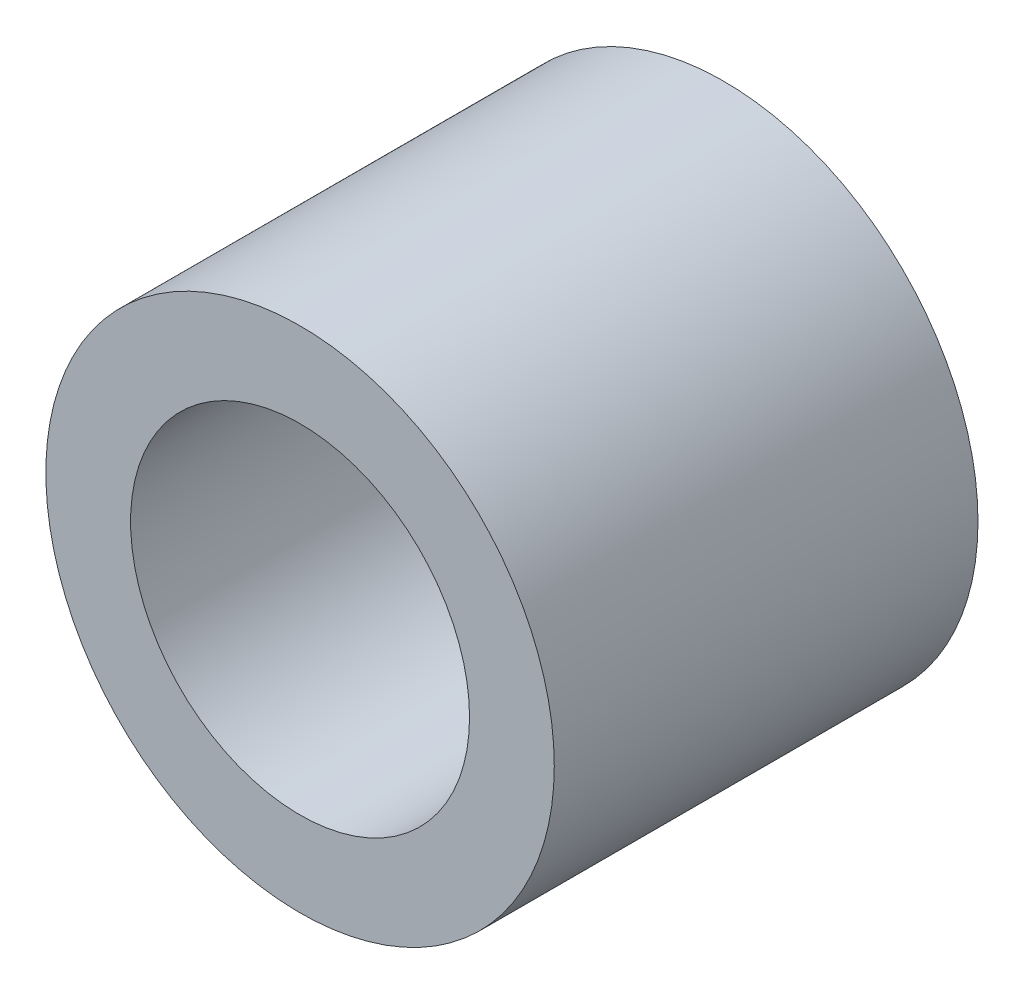
ISO-10303-21;
HEADER;
FILE_DESCRIPTION(('STEP AP214'),'2;1');
FILE_NAME('part.step','',(''),(''),'','','');
FILE_SCHEMA(('AUTOMOTIVE_DESIGN { 1 0 10303 214 1 1 1 1 }'));
ENDSEC;
DATA;
#1=APPLICATION_CONTEXT('core data for automotive mechanical design processes');
#2=APPLICATION_PROTOCOL_DEFINITION('international standard','automotive_design',2000,#1);
#3=PRODUCT_CONTEXT('',#1,'mechanical');
#4=PRODUCT('Part','Part','',(#3));
#5=PRODUCT_RELATED_PRODUCT_CATEGORY('part','',(#4));
#6=PRODUCT_DEFINITION_FORMATION('','',#4);
#7=PRODUCT_DEFINITION_CONTEXT('part definition',#1,'design');
#8=PRODUCT_DEFINITION('design','',#6,#7);
#9=PRODUCT_DEFINITION_SHAPE('','',#8);
#10=(LENGTH_UNIT() NAMED_UNIT(*) SI_UNIT(.MILLI.,.METRE.));
#11=(NAMED_UNIT(*) PLANE_ANGLE_UNIT() SI_UNIT($,.RADIAN.));
#12=(NAMED_UNIT(*) SI_UNIT($,.STERADIAN.) SOLID_ANGLE_UNIT());
#13=UNCERTAINTY_MEASURE_WITH_UNIT(LENGTH_MEASURE(1.E-05),#10,'distance_accuracy_value','');
#14=(GEOMETRIC_REPRESENTATION_CONTEXT(3) GLOBAL_UNCERTAINTY_ASSIGNED_CONTEXT((#13)) GLOBAL_UNIT_ASSIGNED_CONTEXT((#10,
#11,#12)) REPRESENTATION_CONTEXT('',''));
#15=CARTESIAN_POINT('',(0.,0.,0.));
#16=DIRECTION('',(0.,0.,1.));
#17=DIRECTION('',(1.,0.,0.));
#18=AXIS2_PLACEMENT_3D('',#15,#16,#17);
#19=CARTESIAN_POINT('',(0.,0.,127.));
#20=DIRECTION('',(0.,0.,1.));
#21=DIRECTION('',(1.,0.,0.));
#22=AXIS2_PLACEMENT_3D('',#19,#20,#21);
#23=PLANE('',#22);
#24=CARTESIAN_POINT('',(0.,0.,127.));
#25=DIRECTION('',(0.,0.,1.));
#26=DIRECTION('',(1.,0.,0.));
#27=AXIS2_PLACEMENT_3D('',#24,#25,#26);
#28=CIRCLE('',#27,152.4);
#29=CARTESIAN_POINT('',(152.4,0.,127.));
#30=VERTEX_POINT('',#29);
#31=EDGE_CURVE('E10',#30,#30,#28,.T.);
#32=ORIENTED_EDGE('',*,*,#31,.T.);
#33=EDGE_LOOP('',(#32));
#34=FACE_BOUND('',#33,.T.);
#35=CARTESIAN_POINT('',(0.,0.,127.));
#36=DIRECTION('',(0.,0.,1.));
#37=DIRECTION('',(1.,0.,0.));
#38=AXIS2_PLACEMENT_3D('',#35,#36,#37);
#39=CIRCLE('',#38,101.6);
#40=CARTESIAN_POINT('',(101.6,0.,127.));
#41=VERTEX_POINT('',#40);
#42=EDGE_CURVE('E46',#41,#41,#39,.T.);
#43=ORIENTED_EDGE('',*,*,#42,.F.);
#44=EDGE_LOOP('',(#43));
#45=FACE_BOUND('',#44,.T.);
#46=ADVANCED_FACE('F35',(#34,#45),#23,.T.);
#47=CARTESIAN_POINT('',(0.,0.,-127.));
#48=DIRECTION('',(0.,0.,1.));
#49=DIRECTION('',(1.,0.,0.));
#50=AXIS2_PLACEMENT_3D('',#47,#48,#49);
#51=PLANE('',#50);
#52=CARTESIAN_POINT('',(0.,0.,-127.));
#53=DIRECTION('',(0.,0.,1.));
#54=DIRECTION('',(1.,0.,0.));
#55=AXIS2_PLACEMENT_3D('',#52,#53,#54);
#56=CIRCLE('',#55,152.4);
#57=CARTESIAN_POINT('',(152.4,0.,-127.));
#58=VERTEX_POINT('',#57);
#59=EDGE_CURVE('E39',#58,#58,#56,.T.);
#60=ORIENTED_EDGE('',*,*,#59,.F.);
#61=EDGE_LOOP('',(#60));
#62=FACE_BOUND('',#61,.T.);
#63=CARTESIAN_POINT('',(0.,0.,-127.));
#64=DIRECTION('',(0.,0.,1.));
#65=DIRECTION('',(1.,0.,0.));
#66=AXIS2_PLACEMENT_3D('',#63,#64,#65);
#67=CIRCLE('',#66,101.6);
#68=CARTESIAN_POINT('',(101.6,0.,-127.));
#69=VERTEX_POINT('',#68);
#70=EDGE_CURVE('E48',#69,#69,#67,.T.);
#71=ORIENTED_EDGE('',*,*,#70,.T.);
#72=EDGE_LOOP('',(#71));
#73=FACE_BOUND('',#72,.T.);
#74=ADVANCED_FACE('F58',(#62,#73),#51,.F.);
#75=CARTESIAN_POINT('',(0.,0.,127.));
#76=DIRECTION('',(0.,0.,-1.));
#77=DIRECTION('',(-1.,0.,0.));
#78=AXIS2_PLACEMENT_3D('',#75,#76,#77);
#79=CYLINDRICAL_SURFACE('',#78,152.4);
#80=ORIENTED_EDGE('',*,*,#31,.F.);
#81=EDGE_LOOP('',(#80));
#82=FACE_BOUND('',#81,.T.);
#83=ORIENTED_EDGE('',*,*,#59,.T.);
#84=EDGE_LOOP('',(#83));
#85=FACE_BOUND('',#84,.T.);
#86=ADVANCED_FACE('F37',(#82,#85),#79,.T.);
#87=CARTESIAN_POINT('',(0.,0.,127.));
#88=DIRECTION('',(0.,0.,-1.));
#89=DIRECTION('',(-1.,0.,0.));
#90=AXIS2_PLACEMENT_3D('',#87,#88,#89);
#91=CYLINDRICAL_SURFACE('',#90,101.6);
#92=ORIENTED_EDGE('',*,*,#42,.T.);
#93=EDGE_LOOP('',(#92));
#94=FACE_BOUND('',#93,.T.);
#95=ORIENTED_EDGE('',*,*,#70,.F.);
#96=EDGE_LOOP('',(#95));
#97=FACE_BOUND('',#96,.T.);
#98=ADVANCED_FACE('F54',(#94,#97),#91,.F.);
#99=CLOSED_SHELL('',(#46,#74,#86,#98));
#100=MANIFOLD_SOLID_BREP('B2',#99);
#101=ADVANCED_BREP_SHAPE_REPRESENTATION('',(#18,#100),#14);
#102=SHAPE_DEFINITION_REPRESENTATION(#9,#101);
ENDSEC;
END-ISO-10303-21;
